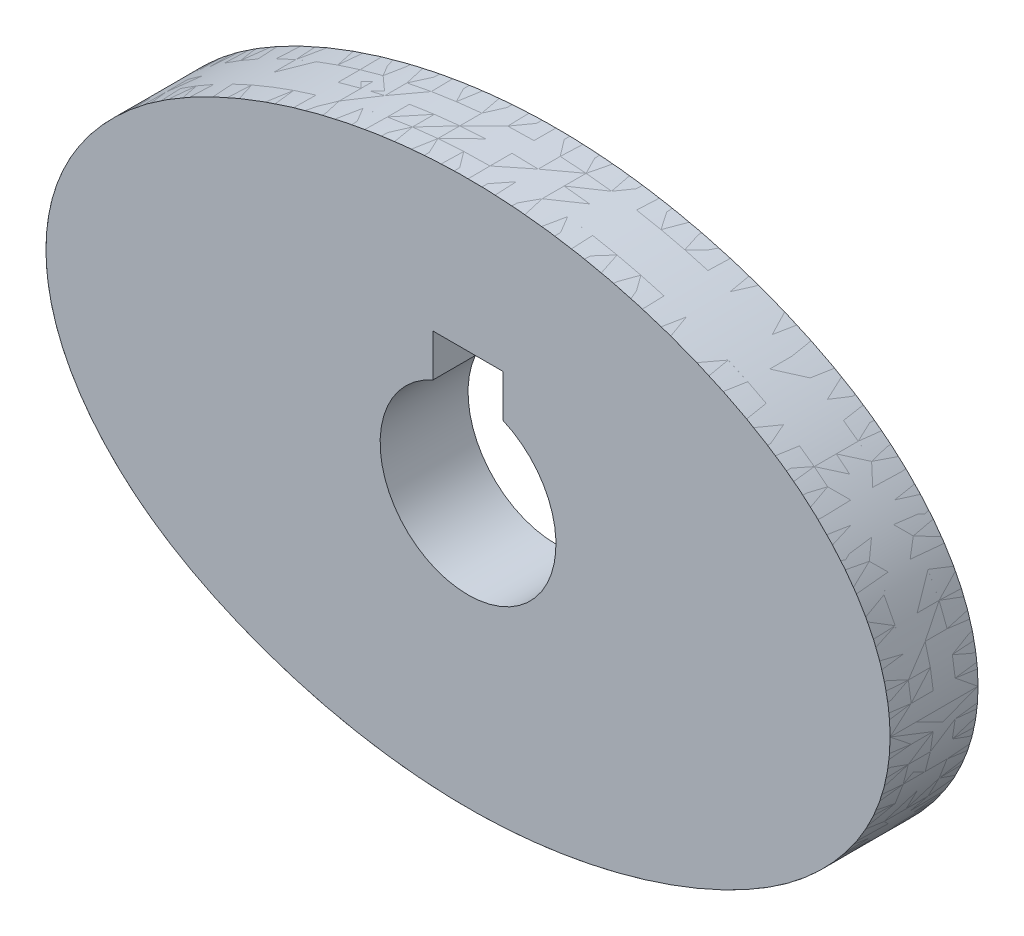
ISO-10303-21;
HEADER;
FILE_DESCRIPTION(('STEP AP214'),'2;1');
FILE_NAME('part.step','',(''),(''),'','','');
FILE_SCHEMA(('AUTOMOTIVE_DESIGN { 1 0 10303 214 1 1 1 1 }'));
ENDSEC;
DATA;
#1=APPLICATION_CONTEXT('core data for automotive mechanical design processes');
#2=APPLICATION_PROTOCOL_DEFINITION('international standard','automotive_design',2000,#1);
#3=PRODUCT_CONTEXT('',#1,'mechanical');
#4=PRODUCT('Part','Part','',(#3));
#5=PRODUCT_RELATED_PRODUCT_CATEGORY('part','',(#4));
#6=PRODUCT_DEFINITION_FORMATION('','',#4);
#7=PRODUCT_DEFINITION_CONTEXT('part definition',#1,'design');
#8=PRODUCT_DEFINITION('design','',#6,#7);
#9=PRODUCT_DEFINITION_SHAPE('','',#8);
#10=(LENGTH_UNIT() NAMED_UNIT(*) SI_UNIT(.MILLI.,.METRE.));
#11=(NAMED_UNIT(*) PLANE_ANGLE_UNIT() SI_UNIT($,.RADIAN.));
#12=(NAMED_UNIT(*) SI_UNIT($,.STERADIAN.) SOLID_ANGLE_UNIT());
#13=UNCERTAINTY_MEASURE_WITH_UNIT(LENGTH_MEASURE(1.E-05),#10,'distance_accuracy_value','');
#14=(GEOMETRIC_REPRESENTATION_CONTEXT(3) GLOBAL_UNCERTAINTY_ASSIGNED_CONTEXT((#13)) GLOBAL_UNIT_ASSIGNED_CONTEXT((#10,
#11,#12)) REPRESENTATION_CONTEXT('',''));
#15=CARTESIAN_POINT('',(0.,0.,0.));
#16=DIRECTION('',(0.,0.,1.));
#17=DIRECTION('',(1.,0.,0.));
#18=AXIS2_PLACEMENT_3D('',#15,#16,#17);
#19=CARTESIAN_POINT('',(24.,0.,5.));
#20=CARTESIAN_POINT('',(24.,2.58333333333333,5.));
#21=CARTESIAN_POINT('',(23.04,5.99333333333333,5.));
#22=CARTESIAN_POINT('',(15.36,12.6066666666667,5.));
#23=CARTESIAN_POINT('',(8.,15.5,5.));
#24=CARTESIAN_POINT('',(-8.,15.5,5.));
#25=CARTESIAN_POINT('',(-15.36,12.6066666666667,5.));
#26=CARTESIAN_POINT('',(-23.04,5.99333333333333,5.));
#27=CARTESIAN_POINT('',(-24.,2.58333333333333,5.));
#28=CARTESIAN_POINT('',(-24.,0.,5.));
#29=B_SPLINE_CURVE_WITH_KNOTS('',3,(#19,#20,#21,#22,#23,#24,#25,#26,#27,#28),.UNSPECIFIED.,.F.,
.F.,(4,2,2,2,4),(0.,0.25,0.5,0.75,1.),.UNSPECIFIED.);
#30=DIRECTION('',(0.,0.,-1.));
#31=VECTOR('',#30,1.);
#32=SURFACE_OF_LINEAR_EXTRUSION('',#29,#31);
#33=CARTESIAN_POINT('',(24.,0.,0.));
#34=CARTESIAN_POINT('',(24.,2.58333333333333,0.));
#35=CARTESIAN_POINT('',(23.04,5.99333333333333,0.));
#36=CARTESIAN_POINT('',(15.36,12.6066666666667,0.));
#37=CARTESIAN_POINT('',(8.,15.5,0.));
#38=CARTESIAN_POINT('',(-8.,15.5,0.));
#39=CARTESIAN_POINT('',(-15.36,12.6066666666667,0.));
#40=CARTESIAN_POINT('',(-23.04,5.99333333333333,0.));
#41=CARTESIAN_POINT('',(-24.,2.58333333333333,0.));
#42=CARTESIAN_POINT('',(-24.,0.,0.));
#43=B_SPLINE_CURVE_WITH_KNOTS('',3,(#33,#34,#35,#36,#37,#38,#39,#40,#41,#42),.UNSPECIFIED.,.F.,
.F.,(4,2,2,2,4),(0.,0.25,0.5,0.75,1.),.UNSPECIFIED.);
#44=CARTESIAN_POINT('',(24.,0.,0.));
#45=VERTEX_POINT('',#44);
#46=CARTESIAN_POINT('',(-24.,0.,0.));
#47=VERTEX_POINT('',#46);
#48=EDGE_CURVE('E53',#45,#47,#43,.T.);
#49=ORIENTED_EDGE('',*,*,#48,.F.);
#50=DIRECTION('',(0.,0.,-1.));
#51=VECTOR('',#50,1.);
#52=CARTESIAN_POINT('',(24.,0.,5.));
#53=LINE('',#52,#51);
#54=CARTESIAN_POINT('',(24.,0.,5.));
#55=VERTEX_POINT('',#54);
#56=EDGE_CURVE('E47',#55,#45,#53,.T.);
#57=ORIENTED_EDGE('',*,*,#56,.F.);
#58=CARTESIAN_POINT('',(-24.,0.,5.));
#59=VERTEX_POINT('',#58);
#60=EDGE_CURVE('E12',#55,#59,#29,.T.);
#61=ORIENTED_EDGE('',*,*,#60,.T.);
#62=DIRECTION('',(0.,0.,-1.));
#63=VECTOR('',#62,1.);
#64=CARTESIAN_POINT('',(-24.,0.,5.));
#65=LINE('',#64,#63);
#66=EDGE_CURVE('E61',#59,#47,#65,.T.);
#67=ORIENTED_EDGE('',*,*,#66,.T.);
#68=EDGE_LOOP('',(#49,#57,#61,#67));
#69=FACE_BOUND('',#68,.T.);
#70=ADVANCED_FACE('F44',(#69),#32,.T.);
#71=CARTESIAN_POINT('',(-24.,0.,5.));
#72=CARTESIAN_POINT('',(-24.,-2.58333333333333,5.));
#73=CARTESIAN_POINT('',(-23.04,-5.99333333333333,5.));
#74=CARTESIAN_POINT('',(-15.36,-12.6066666666667,5.));
#75=CARTESIAN_POINT('',(-8.,-15.5,5.));
#76=CARTESIAN_POINT('',(8.,-15.5,5.));
#77=CARTESIAN_POINT('',(15.36,-12.6066666666667,5.));
#78=CARTESIAN_POINT('',(23.04,-5.99333333333333,5.));
#79=CARTESIAN_POINT('',(24.,-2.58333333333333,5.));
#80=CARTESIAN_POINT('',(24.,0.,5.));
#81=B_SPLINE_CURVE_WITH_KNOTS('',3,(#71,#72,#73,#74,#75,#76,#77,#78,#79,#80),.UNSPECIFIED.,.F.,
.F.,(4,2,2,2,4),(0.,0.25,0.5,0.75,1.),.UNSPECIFIED.);
#82=DIRECTION('',(0.,0.,-1.));
#83=VECTOR('',#82,1.);
#84=SURFACE_OF_LINEAR_EXTRUSION('',#81,#83);
#85=CARTESIAN_POINT('',(-24.,0.,0.));
#86=CARTESIAN_POINT('',(-24.,-2.58333333333333,0.));
#87=CARTESIAN_POINT('',(-23.04,-5.99333333333333,0.));
#88=CARTESIAN_POINT('',(-15.36,-12.6066666666667,0.));
#89=CARTESIAN_POINT('',(-8.,-15.5,0.));
#90=CARTESIAN_POINT('',(8.,-15.5,0.));
#91=CARTESIAN_POINT('',(15.36,-12.6066666666667,0.));
#92=CARTESIAN_POINT('',(23.04,-5.99333333333333,0.));
#93=CARTESIAN_POINT('',(24.,-2.58333333333333,0.));
#94=CARTESIAN_POINT('',(24.,0.,0.));
#95=B_SPLINE_CURVE_WITH_KNOTS('',3,(#85,#86,#87,#88,#89,#90,#91,#92,#93,#94),.UNSPECIFIED.,.F.,
.F.,(4,2,2,2,4),(0.,0.25,0.5,0.75,1.),.UNSPECIFIED.);
#96=EDGE_CURVE('E73',#47,#45,#95,.T.);
#97=ORIENTED_EDGE('',*,*,#96,.F.);
#98=ORIENTED_EDGE('',*,*,#66,.F.);
#99=EDGE_CURVE('E72',#59,#55,#81,.T.);
#100=ORIENTED_EDGE('',*,*,#99,.T.);
#101=ORIENTED_EDGE('',*,*,#56,.T.);
#102=EDGE_LOOP('',(#97,#98,#100,#101));
#103=FACE_BOUND('',#102,.T.);
#104=ADVANCED_FACE('F74',(#103),#84,.T.);
#105=OPEN_SHELL('',(#70,#104));
#106=SHELL_BASED_SURFACE_MODEL('B2',(#105));
#107=CARTESIAN_POINT('',(0.,-15.5,5.));
#108=DIRECTION('',(0.,0.,1.));
#109=DIRECTION('',(1.,0.,0.));
#110=AXIS2_PLACEMENT_3D('',#107,#108,#109);
#111=PLANE('',#110);
#112=CARTESIAN_POINT('',(24.,0.,5.));
#113=CARTESIAN_POINT('',(24.,-2.58333333333333,5.));
#114=CARTESIAN_POINT('',(23.04,-5.99333333333333,5.));
#115=CARTESIAN_POINT('',(15.36,-12.6066666666667,5.));
#116=CARTESIAN_POINT('',(8.,-15.5,5.));
#117=CARTESIAN_POINT('',(-8.,-15.5,5.));
#118=CARTESIAN_POINT('',(-15.36,-12.6066666666667,5.));
#119=CARTESIAN_POINT('',(-23.04,-5.99333333333333,5.));
#120=CARTESIAN_POINT('',(-24.,-2.58333333333333,5.));
#121=CARTESIAN_POINT('',(-24.,0.,5.));
#122=B_SPLINE_CURVE_WITH_KNOTS('',3,(#112,#113,#114,#115,#116,#117,#118,#119,#120,#121),
.UNSPECIFIED.,.F.,.F.,(4,2,2,2,4),(0.,0.25,0.5,0.75,1.),.UNSPECIFIED.);
#123=CARTESIAN_POINT('',(24.,0.,5.));
#124=VERTEX_POINT('',#123);
#125=CARTESIAN_POINT('',(-24.,0.,5.));
#126=VERTEX_POINT('',#125);
#127=EDGE_CURVE('E181',#124,#126,#122,.T.);
#128=ORIENTED_EDGE('',*,*,#127,.F.);
#129=CARTESIAN_POINT('',(-24.,0.,5.));
#130=CARTESIAN_POINT('',(-24.,2.58333333333333,5.));
#131=CARTESIAN_POINT('',(-23.04,5.99333333333333,5.));
#132=CARTESIAN_POINT('',(-15.36,12.6066666666667,5.));
#133=CARTESIAN_POINT('',(-8.,15.5,5.));
#134=CARTESIAN_POINT('',(8.,15.5,5.));
#135=CARTESIAN_POINT('',(15.36,12.6066666666667,5.));
#136=CARTESIAN_POINT('',(23.04,5.99333333333333,5.));
#137=CARTESIAN_POINT('',(24.,2.58333333333333,5.));
#138=CARTESIAN_POINT('',(24.,0.,5.));
#139=B_SPLINE_CURVE_WITH_KNOTS('',3,(#129,#130,#131,#132,#133,#134,#135,#136,#137,#138),
.UNSPECIFIED.,.F.,.F.,(4,2,2,2,4),(0.,0.25,0.5,0.75,1.),.UNSPECIFIED.);
#140=EDGE_CURVE('E170',#126,#124,#139,.T.);
#141=ORIENTED_EDGE('',*,*,#140,.F.);
#142=EDGE_LOOP('',(#128,#141));
#143=FACE_BOUND('',#142,.T.);
#144=CARTESIAN_POINT('',(0.,0.,5.));
#145=DIRECTION('',(0.,0.,-1.));
#146=DIRECTION('',(1.,0.,0.));
#147=AXIS2_PLACEMENT_3D('',#144,#145,#146);
#148=CIRCLE('',#147,5.);
#149=CARTESIAN_POINT('',(2.,4.58257569495584,5.));
#150=VERTEX_POINT('',#149);
#151=CARTESIAN_POINT('',(-2.,4.58257569495584,5.));
#152=VERTEX_POINT('',#151);
#153=EDGE_CURVE('E177',#150,#152,#148,.T.);
#154=ORIENTED_EDGE('',*,*,#153,.T.);
#155=DIRECTION('',(0.,1.,0.));
#156=VECTOR('',#155,1.);
#157=CARTESIAN_POINT('',(-2.,0.,5.));
#158=LINE('',#157,#156);
#159=CARTESIAN_POINT('',(-2.,7.,5.));
#160=VERTEX_POINT('',#159);
#161=EDGE_CURVE('E206',#152,#160,#158,.T.);
#162=ORIENTED_EDGE('',*,*,#161,.T.);
#163=DIRECTION('',(1.,0.,0.));
#164=VECTOR('',#163,1.);
#165=CARTESIAN_POINT('',(0.,7.,5.));
#166=LINE('',#165,#164);
#167=CARTESIAN_POINT('',(2.,7.,5.));
#168=VERTEX_POINT('',#167);
#169=EDGE_CURVE('E312',#160,#168,#166,.T.);
#170=ORIENTED_EDGE('',*,*,#169,.T.);
#171=DIRECTION('',(0.,1.,0.));
#172=VECTOR('',#171,1.);
#173=CARTESIAN_POINT('',(2.,0.,5.));
#174=LINE('',#173,#172);
#175=EDGE_CURVE('E305',#150,#168,#174,.T.);
#176=ORIENTED_EDGE('',*,*,#175,.F.);
#177=EDGE_LOOP('',(#154,#162,#170,#176));
#178=FACE_BOUND('',#177,.T.);
#179=ADVANCED_FACE('F128',(#143,#178),#111,.T.);
#180=CARTESIAN_POINT('',(0.,-15.5,0.));
#181=DIRECTION('',(0.,0.,1.));
#182=DIRECTION('',(1.,0.,0.));
#183=AXIS2_PLACEMENT_3D('',#180,#181,#182);
#184=PLANE('',#183);
#185=CARTESIAN_POINT('',(24.,0.,0.));
#186=CARTESIAN_POINT('',(24.,-2.58333333333333,0.));
#187=CARTESIAN_POINT('',(23.04,-5.99333333333333,0.));
#188=CARTESIAN_POINT('',(15.36,-12.6066666666667,0.));
#189=CARTESIAN_POINT('',(8.,-15.5,0.));
#190=CARTESIAN_POINT('',(-8.,-15.5,0.));
#191=CARTESIAN_POINT('',(-15.36,-12.6066666666667,0.));
#192=CARTESIAN_POINT('',(-23.04,-5.99333333333333,0.));
#193=CARTESIAN_POINT('',(-24.,-2.58333333333333,0.));
#194=CARTESIAN_POINT('',(-24.,0.,0.));
#195=B_SPLINE_CURVE_WITH_KNOTS('',3,(#185,#186,#187,#188,#189,#190,#191,#192,#193,#194),
.UNSPECIFIED.,.F.,.F.,(4,2,2,2,4),(0.,0.25,0.5,0.75,1.),.UNSPECIFIED.);
#196=CARTESIAN_POINT('',(24.,0.,0.));
#197=VERTEX_POINT('',#196);
#198=CARTESIAN_POINT('',(-24.,0.,0.));
#199=VERTEX_POINT('',#198);
#200=EDGE_CURVE('E175',#197,#199,#195,.T.);
#201=ORIENTED_EDGE('',*,*,#200,.T.);
#202=CARTESIAN_POINT('',(-24.,0.,0.));
#203=CARTESIAN_POINT('',(-24.,2.58333333333333,0.));
#204=CARTESIAN_POINT('',(-23.04,5.99333333333333,0.));
#205=CARTESIAN_POINT('',(-15.36,12.6066666666667,0.));
#206=CARTESIAN_POINT('',(-8.,15.5,0.));
#207=CARTESIAN_POINT('',(8.,15.5,0.));
#208=CARTESIAN_POINT('',(15.36,12.6066666666667,0.));
#209=CARTESIAN_POINT('',(23.04,5.99333333333333,0.));
#210=CARTESIAN_POINT('',(24.,2.58333333333333,0.));
#211=CARTESIAN_POINT('',(24.,0.,0.));
#212=B_SPLINE_CURVE_WITH_KNOTS('',3,(#202,#203,#204,#205,#206,#207,#208,#209,#210,#211),
.UNSPECIFIED.,.F.,.F.,(4,2,2,2,4),(0.,0.25,0.5,0.75,1.),.UNSPECIFIED.);
#213=EDGE_CURVE('E168',#199,#197,#212,.T.);
#214=ORIENTED_EDGE('',*,*,#213,.T.);
#215=EDGE_LOOP('',(#201,#214));
#216=FACE_BOUND('',#215,.T.);
#217=DIRECTION('',(0.,1.,0.));
#218=VECTOR('',#217,1.);
#219=CARTESIAN_POINT('',(-2.,-15.5,0.));
#220=LINE('',#219,#218);
#221=CARTESIAN_POINT('',(-2.,4.58257569495584,0.));
#222=VERTEX_POINT('',#221);
#223=CARTESIAN_POINT('',(-2.,7.,0.));
#224=VERTEX_POINT('',#223);
#225=EDGE_CURVE('E202',#222,#224,#220,.T.);
#226=ORIENTED_EDGE('',*,*,#225,.F.);
#227=CARTESIAN_POINT('',(0.,0.,0.));
#228=DIRECTION('',(0.,0.,-1.));
#229=DIRECTION('',(1.,0.,0.));
#230=AXIS2_PLACEMENT_3D('',#227,#228,#229);
#231=CIRCLE('',#230,5.);
#232=CARTESIAN_POINT('',(2.,4.58257569495584,0.));
#233=VERTEX_POINT('',#232);
#234=EDGE_CURVE('E213',#233,#222,#231,.T.);
#235=ORIENTED_EDGE('',*,*,#234,.F.);
#236=DIRECTION('',(0.,1.,0.));
#237=VECTOR('',#236,1.);
#238=CARTESIAN_POINT('',(2.,-15.5,0.));
#239=LINE('',#238,#237);
#240=CARTESIAN_POINT('',(2.,7.,0.));
#241=VERTEX_POINT('',#240);
#242=EDGE_CURVE('E144',#233,#241,#239,.T.);
#243=ORIENTED_EDGE('',*,*,#242,.T.);
#244=DIRECTION('',(1.,0.,0.));
#245=VECTOR('',#244,1.);
#246=CARTESIAN_POINT('',(0.,7.,0.));
#247=LINE('',#246,#245);
#248=EDGE_CURVE('E42',#224,#241,#247,.T.);
#249=ORIENTED_EDGE('',*,*,#248,.F.);
#250=EDGE_LOOP('',(#226,#235,#243,#249));
#251=FACE_BOUND('',#250,.T.);
#252=ADVANCED_FACE('F179',(#216,#251),#184,.F.);
#253=CARTESIAN_POINT('',(0.,0.,5.));
#254=DIRECTION('',(0.,0.,-1.));
#255=DIRECTION('',(-1.,0.,0.));
#256=AXIS2_PLACEMENT_3D('',#253,#254,#255);
#257=CYLINDRICAL_SURFACE('',#256,5.);
#258=DIRECTION('',(0.,0.,-1.));
#259=VECTOR('',#258,1.);
#260=CARTESIAN_POINT('',(-2.,4.58257569495584,5.));
#261=LINE('',#260,#259);
#262=EDGE_CURVE('E137',#152,#222,#261,.T.);
#263=ORIENTED_EDGE('',*,*,#262,.F.);
#264=ORIENTED_EDGE('',*,*,#153,.F.);
#265=DIRECTION('',(0.,0.,-1.));
#266=VECTOR('',#265,1.);
#267=CARTESIAN_POINT('',(2.,4.58257569495584,5.));
#268=LINE('',#267,#266);
#269=EDGE_CURVE('E171',#150,#233,#268,.T.);
#270=ORIENTED_EDGE('',*,*,#269,.T.);
#271=ORIENTED_EDGE('',*,*,#234,.T.);
#272=EDGE_LOOP('',(#263,#264,#270,#271));
#273=FACE_BOUND('',#272,.T.);
#274=ADVANCED_FACE('F215',(#273),#257,.F.);
#275=DIRECTION('',(0.,0.,-1.));
#276=VECTOR('',#275,1.);
#277=SURFACE_OF_LINEAR_EXTRUSION('',#122,#276);
#278=ORIENTED_EDGE('',*,*,#200,.F.);
#279=DIRECTION('',(0.,0.,-1.));
#280=VECTOR('',#279,1.);
#281=CARTESIAN_POINT('',(24.,0.,5.));
#282=LINE('',#281,#280);
#283=EDGE_CURVE('E153',#124,#197,#282,.T.);
#284=ORIENTED_EDGE('',*,*,#283,.F.);
#285=ORIENTED_EDGE('',*,*,#127,.T.);
#286=DIRECTION('',(0.,0.,-1.));
#287=VECTOR('',#286,1.);
#288=CARTESIAN_POINT('',(-24.,0.,5.));
#289=LINE('',#288,#287);
#290=EDGE_CURVE('E172',#126,#199,#289,.T.);
#291=ORIENTED_EDGE('',*,*,#290,.T.);
#292=EDGE_LOOP('',(#278,#284,#285,#291));
#293=FACE_BOUND('',#292,.T.);
#294=ADVANCED_FACE('F130',(#293),#277,.T.);
#295=DIRECTION('',(0.,0.,-1.));
#296=VECTOR('',#295,1.);
#297=SURFACE_OF_LINEAR_EXTRUSION('',#139,#296);
#298=ORIENTED_EDGE('',*,*,#213,.F.);
#299=ORIENTED_EDGE('',*,*,#290,.F.);
#300=ORIENTED_EDGE('',*,*,#140,.T.);
#301=ORIENTED_EDGE('',*,*,#283,.T.);
#302=EDGE_LOOP('',(#298,#299,#300,#301));
#303=FACE_BOUND('',#302,.T.);
#304=ADVANCED_FACE('F166',(#303),#297,.T.);
#305=CARTESIAN_POINT('',(0.,7.,-5.));
#306=DIRECTION('',(0.,-1.,0.));
#307=DIRECTION('',(0.,0.,-1.));
#308=AXIS2_PLACEMENT_3D('',#305,#306,#307);
#309=PLANE('',#308);
#310=ORIENTED_EDGE('',*,*,#248,.T.);
#311=DIRECTION('',(0.,0.,1.));
#312=VECTOR('',#311,1.);
#313=CARTESIAN_POINT('',(2.,7.,-5.));
#314=LINE('',#313,#312);
#315=EDGE_CURVE('E300',#241,#168,#314,.T.);
#316=ORIENTED_EDGE('',*,*,#315,.T.);
#317=ORIENTED_EDGE('',*,*,#169,.F.);
#318=DIRECTION('',(0.,0.,1.));
#319=VECTOR('',#318,1.);
#320=CARTESIAN_POINT('',(-2.,7.,-5.));
#321=LINE('',#320,#319);
#322=EDGE_CURVE('E302',#224,#160,#321,.T.);
#323=ORIENTED_EDGE('',*,*,#322,.F.);
#324=EDGE_LOOP('',(#310,#316,#317,#323));
#325=FACE_BOUND('',#324,.T.);
#326=ADVANCED_FACE('F232',(#325),#309,.T.);
#327=CARTESIAN_POINT('',(-2.,0.,-5.));
#328=DIRECTION('',(1.,0.,0.));
#329=DIRECTION('',(0.,0.,-1.));
#330=AXIS2_PLACEMENT_3D('',#327,#328,#329);
#331=PLANE('',#330);
#332=ORIENTED_EDGE('',*,*,#225,.T.);
#333=ORIENTED_EDGE('',*,*,#322,.T.);
#334=ORIENTED_EDGE('',*,*,#161,.F.);
#335=ORIENTED_EDGE('',*,*,#262,.T.);
#336=EDGE_LOOP('',(#332,#333,#334,#335));
#337=FACE_BOUND('',#336,.T.);
#338=ADVANCED_FACE('F199',(#337),#331,.T.);
#339=CARTESIAN_POINT('',(2.,0.,-5.));
#340=DIRECTION('',(1.,0.,0.));
#341=DIRECTION('',(0.,0.,-1.));
#342=AXIS2_PLACEMENT_3D('',#339,#340,#341);
#343=PLANE('',#342);
#344=ORIENTED_EDGE('',*,*,#269,.F.);
#345=ORIENTED_EDGE('',*,*,#175,.T.);
#346=ORIENTED_EDGE('',*,*,#315,.F.);
#347=ORIENTED_EDGE('',*,*,#242,.F.);
#348=EDGE_LOOP('',(#344,#345,#346,#347));
#349=FACE_BOUND('',#348,.T.);
#350=ADVANCED_FACE('F240',(#349),#343,.F.);
#351=CLOSED_SHELL('',(#179,#252,#274,#294,#304,#326,#338,#350));
#352=MANIFOLD_SOLID_BREP('B6',#351);
#353=ADVANCED_BREP_SHAPE_REPRESENTATION('',(#18,#352),#14);
#354=MANIFOLD_SURFACE_SHAPE_REPRESENTATION('',(#18,#106),#14);
#355=SHAPE_REPRESENTATION('',(#18),#14);
#356=SHAPE_DEFINITION_REPRESENTATION(#9,#355);
#357=SHAPE_REPRESENTATION_RELATIONSHIP('','',#355,#353);
#358=SHAPE_REPRESENTATION_RELATIONSHIP('','',#355,#354);
ENDSEC;
END-ISO-10303-21;
